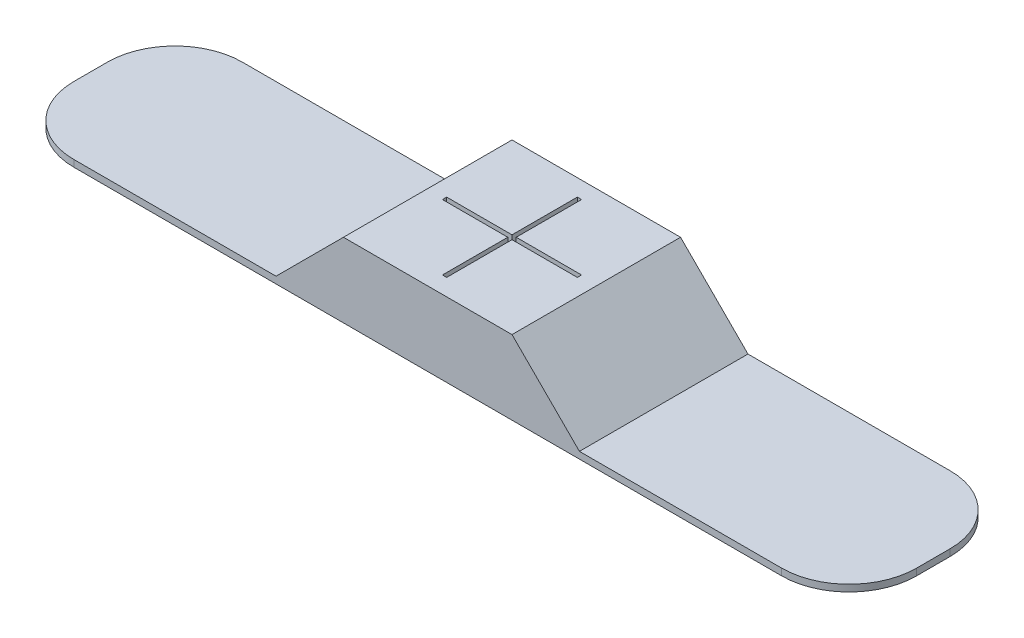
ISO-10303-21;
HEADER;
FILE_DESCRIPTION(('STEP AP214'),'2;1');
FILE_NAME('part.step','',(''),(''),'','','');
FILE_SCHEMA(('AUTOMOTIVE_DESIGN { 1 0 10303 214 1 1 1 1 }'));
ENDSEC;
DATA;
#1=APPLICATION_CONTEXT('core data for automotive mechanical design processes');
#2=APPLICATION_PROTOCOL_DEFINITION('international standard','automotive_design',2000,#1);
#3=PRODUCT_CONTEXT('',#1,'mechanical');
#4=PRODUCT('Part','Part','',(#3));
#5=PRODUCT_RELATED_PRODUCT_CATEGORY('part','',(#4));
#6=PRODUCT_DEFINITION_FORMATION('','',#4);
#7=PRODUCT_DEFINITION_CONTEXT('part definition',#1,'design');
#8=PRODUCT_DEFINITION('design','',#6,#7);
#9=PRODUCT_DEFINITION_SHAPE('','',#8);
#10=(LENGTH_UNIT() NAMED_UNIT(*) SI_UNIT(.MILLI.,.METRE.));
#11=(NAMED_UNIT(*) PLANE_ANGLE_UNIT() SI_UNIT($,.RADIAN.));
#12=(NAMED_UNIT(*) SI_UNIT($,.STERADIAN.) SOLID_ANGLE_UNIT());
#13=UNCERTAINTY_MEASURE_WITH_UNIT(LENGTH_MEASURE(1.E-05),#10,'distance_accuracy_value','');
#14=(GEOMETRIC_REPRESENTATION_CONTEXT(3) GLOBAL_UNCERTAINTY_ASSIGNED_CONTEXT((#13)) GLOBAL_UNIT_ASSIGNED_CONTEXT((#10,
#11,#12)) REPRESENTATION_CONTEXT('',''));
#15=CARTESIAN_POINT('',(0.,0.,0.));
#16=DIRECTION('',(0.,0.,1.));
#17=DIRECTION('',(1.,0.,0.));
#18=AXIS2_PLACEMENT_3D('',#15,#16,#17);
#19=CARTESIAN_POINT('',(0.,25.4,31.75));
#20=DIRECTION('',(0.,0.,-1.));
#21=DIRECTION('',(-1.,0.,0.));
#22=AXIS2_PLACEMENT_3D('',#19,#20,#21);
#23=PLANE('',#22);
#24=DIRECTION('',(-1.,0.,0.));
#25=VECTOR('',#24,1.);
#26=CARTESIAN_POINT('',(0.,0.,31.75));
#27=LINE('',#26,#25);
#28=CARTESIAN_POINT('',(-57.1500000000002,0.,31.75));
#29=VERTEX_POINT('',#28);
#30=CARTESIAN_POINT('',(-133.35,0.,31.75));
#31=VERTEX_POINT('',#30);
#32=EDGE_CURVE('E400',#29,#31,#27,.T.);
#33=ORIENTED_EDGE('',*,*,#32,.T.);
#34=DIRECTION('',(0.,1.,0.));
#35=VECTOR('',#34,1.);
#36=CARTESIAN_POINT('',(-133.35,-2.54,31.75));
#37=LINE('',#36,#35);
#38=CARTESIAN_POINT('',(-133.35,-2.54,31.75));
#39=VERTEX_POINT('',#38);
#40=EDGE_CURVE('E365',#31,#39,#37,.F.);
#41=ORIENTED_EDGE('',*,*,#40,.T.);
#42=DIRECTION('',(1.,0.,0.));
#43=VECTOR('',#42,1.);
#44=CARTESIAN_POINT('',(0.,-2.54,31.75));
#45=LINE('',#44,#43);
#46=CARTESIAN_POINT('',(133.35,-2.54,31.75));
#47=VERTEX_POINT('',#46);
#48=EDGE_CURVE('E281',#39,#47,#45,.T.);
#49=ORIENTED_EDGE('',*,*,#48,.T.);
#50=DIRECTION('',(0.,1.,0.));
#51=VECTOR('',#50,1.);
#52=CARTESIAN_POINT('',(133.35,25.4,31.75));
#53=LINE('',#52,#51);
#54=CARTESIAN_POINT('',(133.35,0.,31.75));
#55=VERTEX_POINT('',#54);
#56=EDGE_CURVE('E362',#47,#55,#53,.T.);
#57=ORIENTED_EDGE('',*,*,#56,.T.);
#58=DIRECTION('',(1.,0.,0.));
#59=VECTOR('',#58,1.);
#60=CARTESIAN_POINT('',(0.,0.,31.75));
#61=LINE('',#60,#59);
#62=CARTESIAN_POINT('',(57.1499999999999,0.,31.75));
#63=VERTEX_POINT('',#62);
#64=EDGE_CURVE('E397',#63,#55,#61,.T.);
#65=ORIENTED_EDGE('',*,*,#64,.F.);
#66=DIRECTION('',(-0.707106781186544,0.707106781186551,0.));
#67=VECTOR('',#66,1.);
#68=CARTESIAN_POINT('',(15.8750000000002,41.2750000000001,31.75));
#69=LINE('',#68,#67);
#70=CARTESIAN_POINT('',(31.75,25.4,31.75));
#71=VERTEX_POINT('',#70);
#72=EDGE_CURVE('E351',#63,#71,#69,.T.);
#73=ORIENTED_EDGE('',*,*,#72,.T.);
#74=DIRECTION('',(1.,0.,0.));
#75=VECTOR('',#74,1.);
#76=CARTESIAN_POINT('',(0.,25.4,31.75));
#77=LINE('',#76,#75);
#78=CARTESIAN_POINT('',(-31.75,25.4,31.75));
#79=VERTEX_POINT('',#78);
#80=EDGE_CURVE('E433',#79,#71,#77,.T.);
#81=ORIENTED_EDGE('',*,*,#80,.F.);
#82=DIRECTION('',(0.707106781186551,0.707106781186544,0.));
#83=VECTOR('',#82,1.);
#84=CARTESIAN_POINT('',(-15.8749999999998,41.275,31.75));
#85=LINE('',#84,#83);
#86=EDGE_CURVE('E347',#79,#29,#85,.F.);
#87=ORIENTED_EDGE('',*,*,#86,.T.);
#88=EDGE_LOOP('',(#33,#41,#49,#57,#65,#73,#81,#87));
#89=FACE_BOUND('',#88,.T.);
#90=ADVANCED_FACE('F93',(#89),#23,.F.);
#91=CARTESIAN_POINT('',(0.,25.4,-31.75));
#92=DIRECTION('',(0.,0.,-1.));
#93=DIRECTION('',(-1.,0.,0.));
#94=AXIS2_PLACEMENT_3D('',#91,#92,#93);
#95=PLANE('',#94);
#96=DIRECTION('',(1.,0.,0.));
#97=VECTOR('',#96,1.);
#98=CARTESIAN_POINT('',(0.,-2.54,-31.75));
#99=LINE('',#98,#97);
#100=CARTESIAN_POINT('',(-133.35,-2.54,-31.75));
#101=VERTEX_POINT('',#100);
#102=CARTESIAN_POINT('',(133.35,-2.54,-31.75));
#103=VERTEX_POINT('',#102);
#104=EDGE_CURVE('E278',#101,#103,#99,.T.);
#105=ORIENTED_EDGE('',*,*,#104,.F.);
#106=DIRECTION('',(0.,1.,0.));
#107=VECTOR('',#106,1.);
#108=CARTESIAN_POINT('',(-133.35,25.4,-31.75));
#109=LINE('',#108,#107);
#110=CARTESIAN_POINT('',(-133.35,0.,-31.75));
#111=VERTEX_POINT('',#110);
#112=EDGE_CURVE('E377',#101,#111,#109,.T.);
#113=ORIENTED_EDGE('',*,*,#112,.T.);
#114=DIRECTION('',(-1.,0.,0.));
#115=VECTOR('',#114,1.);
#116=CARTESIAN_POINT('',(0.,0.,-31.75));
#117=LINE('',#116,#115);
#118=CARTESIAN_POINT('',(-57.1500000000002,0.,-31.75));
#119=VERTEX_POINT('',#118);
#120=EDGE_CURVE('E479',#119,#111,#117,.T.);
#121=ORIENTED_EDGE('',*,*,#120,.F.);
#122=DIRECTION('',(-0.707106781186551,-0.707106781186544,0.));
#123=VECTOR('',#122,1.);
#124=CARTESIAN_POINT('',(-57.1500000000002,0.,-31.75));
#125=LINE('',#124,#123);
#126=CARTESIAN_POINT('',(-31.75,25.4,-31.75));
#127=VERTEX_POINT('',#126);
#128=EDGE_CURVE('E345',#119,#127,#125,.F.);
#129=ORIENTED_EDGE('',*,*,#128,.T.);
#130=DIRECTION('',(1.,0.,0.));
#131=VECTOR('',#130,1.);
#132=CARTESIAN_POINT('',(0.,25.4,-31.75));
#133=LINE('',#132,#131);
#134=CARTESIAN_POINT('',(31.75,25.4,-31.75));
#135=VERTEX_POINT('',#134);
#136=EDGE_CURVE('E438',#127,#135,#133,.T.);
#137=ORIENTED_EDGE('',*,*,#136,.T.);
#138=DIRECTION('',(0.707106781186544,-0.707106781186551,0.));
#139=VECTOR('',#138,1.);
#140=CARTESIAN_POINT('',(31.75,25.4000000000002,-31.75));
#141=LINE('',#140,#139);
#142=CARTESIAN_POINT('',(57.1499999999999,0.,-31.75));
#143=VERTEX_POINT('',#142);
#144=EDGE_CURVE('E349',#135,#143,#141,.T.);
#145=ORIENTED_EDGE('',*,*,#144,.T.);
#146=DIRECTION('',(1.,0.,0.));
#147=VECTOR('',#146,1.);
#148=CARTESIAN_POINT('',(0.,0.,-31.75));
#149=LINE('',#148,#147);
#150=CARTESIAN_POINT('',(133.35,0.,-31.75));
#151=VERTEX_POINT('',#150);
#152=EDGE_CURVE('E394',#143,#151,#149,.T.);
#153=ORIENTED_EDGE('',*,*,#152,.T.);
#154=DIRECTION('',(0.,1.,0.));
#155=VECTOR('',#154,1.);
#156=CARTESIAN_POINT('',(133.35,-2.54,-31.75));
#157=LINE('',#156,#155);
#158=EDGE_CURVE('E375',#151,#103,#157,.F.);
#159=ORIENTED_EDGE('',*,*,#158,.T.);
#160=EDGE_LOOP('',(#105,#113,#121,#129,#137,#145,#153,#159));
#161=FACE_BOUND('',#160,.T.);
#162=ADVANCED_FACE('F456',(#161),#95,.T.);
#163=CARTESIAN_POINT('',(-0.793750000000017,25.4,0.));
#164=DIRECTION('',(1.,0.,0.));
#165=DIRECTION('',(0.,0.,-1.));
#166=AXIS2_PLACEMENT_3D('',#163,#164,#165);
#167=PLANE('',#166);
#168=DIRECTION('',(0.,0.,1.));
#169=VECTOR('',#168,1.);
#170=CARTESIAN_POINT('',(-0.793750000000017,0.,0.));
#171=LINE('',#170,#169);
#172=CARTESIAN_POINT('',(-0.793749999999998,0.,-25.4));
#173=VERTEX_POINT('',#172);
#174=CARTESIAN_POINT('',(-0.793749999999999,0.,-0.793750000000011));
#175=VERTEX_POINT('',#174);
#176=EDGE_CURVE('E256',#173,#175,#171,.T.);
#177=ORIENTED_EDGE('',*,*,#176,.F.);
#178=DIRECTION('',(0.,-1.,0.));
#179=VECTOR('',#178,1.);
#180=CARTESIAN_POINT('',(-0.793749999999998,25.4,-25.4));
#181=LINE('',#180,#179);
#182=CARTESIAN_POINT('',(-0.793749999999998,25.4,-25.4));
#183=VERTEX_POINT('',#182);
#184=EDGE_CURVE('E265',#183,#173,#181,.T.);
#185=ORIENTED_EDGE('',*,*,#184,.F.);
#186=DIRECTION('',(0.,0.,1.));
#187=VECTOR('',#186,1.);
#188=CARTESIAN_POINT('',(-0.793750000000017,25.4,0.));
#189=LINE('',#188,#187);
#190=CARTESIAN_POINT('',(-0.793749999999999,25.4,-0.793750000000011));
#191=VERTEX_POINT('',#190);
#192=EDGE_CURVE('E311',#183,#191,#189,.T.);
#193=ORIENTED_EDGE('',*,*,#192,.T.);
#194=DIRECTION('',(0.,-1.,0.));
#195=VECTOR('',#194,1.);
#196=CARTESIAN_POINT('',(-0.793749999999999,25.4,-0.793750000000011));
#197=LINE('',#196,#195);
#198=EDGE_CURVE('E276',#191,#175,#197,.T.);
#199=ORIENTED_EDGE('',*,*,#198,.T.);
#200=EDGE_LOOP('',(#177,#185,#193,#199));
#201=FACE_BOUND('',#200,.T.);
#202=ADVANCED_FACE('F274',(#201),#167,.T.);
#203=CARTESIAN_POINT('',(0.,25.4,-25.4));
#204=DIRECTION('',(0.,0.,-1.));
#205=DIRECTION('',(-1.,0.,0.));
#206=AXIS2_PLACEMENT_3D('',#203,#204,#205);
#207=PLANE('',#206);
#208=DIRECTION('',(1.,0.,0.));
#209=VECTOR('',#208,1.);
#210=CARTESIAN_POINT('',(0.,0.,-25.4));
#211=LINE('',#210,#209);
#212=CARTESIAN_POINT('',(0.793750000000001,0.,-25.4));
#213=VERTEX_POINT('',#212);
#214=EDGE_CURVE('E252',#173,#213,#211,.T.);
#215=ORIENTED_EDGE('',*,*,#214,.T.);
#216=DIRECTION('',(0.,-1.,0.));
#217=VECTOR('',#216,1.);
#218=CARTESIAN_POINT('',(0.793750000000001,25.4,-25.4));
#219=LINE('',#218,#217);
#220=CARTESIAN_POINT('',(0.793750000000001,25.4,-25.4));
#221=VERTEX_POINT('',#220);
#222=EDGE_CURVE('E272',#221,#213,#219,.T.);
#223=ORIENTED_EDGE('',*,*,#222,.F.);
#224=DIRECTION('',(1.,0.,0.));
#225=VECTOR('',#224,1.);
#226=CARTESIAN_POINT('',(0.,25.4,-25.4));
#227=LINE('',#226,#225);
#228=EDGE_CURVE('E267',#183,#221,#227,.T.);
#229=ORIENTED_EDGE('',*,*,#228,.F.);
#230=ORIENTED_EDGE('',*,*,#184,.T.);
#231=EDGE_LOOP('',(#215,#223,#229,#230));
#232=FACE_BOUND('',#231,.T.);
#233=ADVANCED_FACE('F266',(#232),#207,.F.);
#234=CARTESIAN_POINT('',(0.793749999999989,25.4,0.));
#235=DIRECTION('',(1.,0.,0.));
#236=DIRECTION('',(0.,0.,-1.));
#237=AXIS2_PLACEMENT_3D('',#234,#235,#236);
#238=PLANE('',#237);
#239=DIRECTION('',(0.,0.,1.));
#240=VECTOR('',#239,1.);
#241=CARTESIAN_POINT('',(0.793749999999989,0.,0.));
#242=LINE('',#241,#240);
#243=CARTESIAN_POINT('',(0.793750000000006,0.,-0.793750000000003));
#244=VERTEX_POINT('',#243);
#245=EDGE_CURVE('E259',#213,#244,#242,.T.);
#246=ORIENTED_EDGE('',*,*,#245,.T.);
#247=DIRECTION('',(0.,-1.,0.));
#248=VECTOR('',#247,1.);
#249=CARTESIAN_POINT('',(0.793750000000006,25.4,-0.793750000000003));
#250=LINE('',#249,#248);
#251=CARTESIAN_POINT('',(0.793750000000006,25.4,-0.793750000000003));
#252=VERTEX_POINT('',#251);
#253=EDGE_CURVE('E337',#252,#244,#250,.T.);
#254=ORIENTED_EDGE('',*,*,#253,.F.);
#255=DIRECTION('',(0.,0.,1.));
#256=VECTOR('',#255,1.);
#257=CARTESIAN_POINT('',(0.793749999999989,25.4,0.));
#258=LINE('',#257,#256);
#259=EDGE_CURVE('E410',#221,#252,#258,.T.);
#260=ORIENTED_EDGE('',*,*,#259,.F.);
#261=ORIENTED_EDGE('',*,*,#222,.T.);
#262=EDGE_LOOP('',(#246,#254,#260,#261));
#263=FACE_BOUND('',#262,.T.);
#264=ADVANCED_FACE('F542',(#263),#238,.F.);
#265=CARTESIAN_POINT('',(0.,25.4,-0.793750000000012));
#266=DIRECTION('',(0.,0.,1.));
#267=DIRECTION('',(1.,0.,0.));
#268=AXIS2_PLACEMENT_3D('',#265,#266,#267);
#269=PLANE('',#268);
#270=DIRECTION('',(-1.,0.,0.));
#271=VECTOR('',#270,1.);
#272=CARTESIAN_POINT('',(0.,0.,-0.793750000000012));
#273=LINE('',#272,#271);
#274=CARTESIAN_POINT('',(25.4,0.,-0.793749999999731));
#275=VERTEX_POINT('',#274);
#276=EDGE_CURVE('E288',#275,#244,#273,.T.);
#277=ORIENTED_EDGE('',*,*,#276,.F.);
#278=DIRECTION('',(0.,-1.,0.));
#279=VECTOR('',#278,1.);
#280=CARTESIAN_POINT('',(25.4,25.4,-0.793749999999731));
#281=LINE('',#280,#279);
#282=CARTESIAN_POINT('',(25.4,25.4,-0.793749999999731));
#283=VERTEX_POINT('',#282);
#284=EDGE_CURVE('E334',#283,#275,#281,.T.);
#285=ORIENTED_EDGE('',*,*,#284,.F.);
#286=DIRECTION('',(-1.,0.,0.));
#287=VECTOR('',#286,1.);
#288=CARTESIAN_POINT('',(0.,25.4,-0.793750000000012));
#289=LINE('',#288,#287);
#290=EDGE_CURVE('E412',#283,#252,#289,.T.);
#291=ORIENTED_EDGE('',*,*,#290,.T.);
#292=ORIENTED_EDGE('',*,*,#253,.T.);
#293=EDGE_LOOP('',(#277,#285,#291,#292));
#294=FACE_BOUND('',#293,.T.);
#295=ADVANCED_FACE('F538',(#294),#269,.T.);
#296=CARTESIAN_POINT('',(25.4,25.4,2.22044604925031E-13));
#297=DIRECTION('',(1.,0.,0.));
#298=DIRECTION('',(0.,0.,-1.));
#299=AXIS2_PLACEMENT_3D('',#296,#297,#298);
#300=PLANE('',#299);
#301=DIRECTION('',(0.,0.,1.));
#302=VECTOR('',#301,1.);
#303=CARTESIAN_POINT('',(25.4,0.,2.22044604925031E-13));
#304=LINE('',#303,#302);
#305=CARTESIAN_POINT('',(25.4,0.,0.793750000000268));
#306=VERTEX_POINT('',#305);
#307=EDGE_CURVE('E290',#275,#306,#304,.T.);
#308=ORIENTED_EDGE('',*,*,#307,.T.);
#309=DIRECTION('',(0.,-1.,0.));
#310=VECTOR('',#309,1.);
#311=CARTESIAN_POINT('',(25.4,25.4,0.793750000000268));
#312=LINE('',#311,#310);
#313=CARTESIAN_POINT('',(25.4,25.4,0.793750000000268));
#314=VERTEX_POINT('',#313);
#315=EDGE_CURVE('E331',#314,#306,#312,.T.);
#316=ORIENTED_EDGE('',*,*,#315,.F.);
#317=DIRECTION('',(0.,0.,1.));
#318=VECTOR('',#317,1.);
#319=CARTESIAN_POINT('',(25.4,25.4,2.22044604925031E-13));
#320=LINE('',#319,#318);
#321=EDGE_CURVE('E415',#283,#314,#320,.T.);
#322=ORIENTED_EDGE('',*,*,#321,.F.);
#323=ORIENTED_EDGE('',*,*,#284,.T.);
#324=EDGE_LOOP('',(#308,#316,#322,#323));
#325=FACE_BOUND('',#324,.T.);
#326=ADVANCED_FACE('F534',(#325),#300,.F.);
#327=CARTESIAN_POINT('',(0.,25.4,0.793749999999997));
#328=DIRECTION('',(0.,0.,1.));
#329=DIRECTION('',(1.,0.,0.));
#330=AXIS2_PLACEMENT_3D('',#327,#328,#329);
#331=PLANE('',#330);
#332=DIRECTION('',(-1.,0.,0.));
#333=VECTOR('',#332,1.);
#334=CARTESIAN_POINT('',(0.,0.,0.793749999999997));
#335=LINE('',#334,#333);
#336=CARTESIAN_POINT('',(0.793750000000005,0.,0.793750000000006));
#337=VERTEX_POINT('',#336);
#338=EDGE_CURVE('E293',#306,#337,#335,.T.);
#339=ORIENTED_EDGE('',*,*,#338,.T.);
#340=DIRECTION('',(0.,-1.,0.));
#341=VECTOR('',#340,1.);
#342=CARTESIAN_POINT('',(0.793750000000005,25.4,0.793750000000006));
#343=LINE('',#342,#341);
#344=CARTESIAN_POINT('',(0.793750000000005,25.4,0.793750000000006));
#345=VERTEX_POINT('',#344);
#346=EDGE_CURVE('E328',#345,#337,#343,.T.);
#347=ORIENTED_EDGE('',*,*,#346,.F.);
#348=DIRECTION('',(-1.,0.,0.));
#349=VECTOR('',#348,1.);
#350=CARTESIAN_POINT('',(0.,25.4,0.793749999999997));
#351=LINE('',#350,#349);
#352=EDGE_CURVE('E417',#314,#345,#351,.T.);
#353=ORIENTED_EDGE('',*,*,#352,.F.);
#354=ORIENTED_EDGE('',*,*,#315,.T.);
#355=EDGE_LOOP('',(#339,#347,#353,#354));
#356=FACE_BOUND('',#355,.T.);
#357=ADVANCED_FACE('F530',(#356),#331,.F.);
#358=CARTESIAN_POINT('',(0.793750000000016,25.4,0.));
#359=DIRECTION('',(-1.,0.,0.));
#360=DIRECTION('',(0.,0.,1.));
#361=AXIS2_PLACEMENT_3D('',#358,#359,#360);
#362=PLANE('',#361);
#363=DIRECTION('',(0.,0.,-1.));
#364=VECTOR('',#363,1.);
#365=CARTESIAN_POINT('',(0.793750000000016,0.,0.));
#366=LINE('',#365,#364);
#367=CARTESIAN_POINT('',(0.793749999999642,0.,25.4));
#368=VERTEX_POINT('',#367);
#369=EDGE_CURVE('E296',#368,#337,#366,.T.);
#370=ORIENTED_EDGE('',*,*,#369,.F.);
#371=DIRECTION('',(0.,-1.,0.));
#372=VECTOR('',#371,1.);
#373=CARTESIAN_POINT('',(0.793749999999642,25.4,25.4));
#374=LINE('',#373,#372);
#375=CARTESIAN_POINT('',(0.793749999999642,25.4,25.4));
#376=VERTEX_POINT('',#375);
#377=EDGE_CURVE('E325',#376,#368,#374,.T.);
#378=ORIENTED_EDGE('',*,*,#377,.F.);
#379=DIRECTION('',(0.,0.,-1.));
#380=VECTOR('',#379,1.);
#381=CARTESIAN_POINT('',(0.793750000000016,25.4,0.));
#382=LINE('',#381,#380);
#383=EDGE_CURVE('E419',#376,#345,#382,.T.);
#384=ORIENTED_EDGE('',*,*,#383,.T.);
#385=ORIENTED_EDGE('',*,*,#346,.T.);
#386=EDGE_LOOP('',(#370,#378,#384,#385));
#387=FACE_BOUND('',#386,.T.);
#388=ADVANCED_FACE('F526',(#387),#362,.T.);
#389=CARTESIAN_POINT('',(-3.33066907387547E-13,25.4,25.4));
#390=DIRECTION('',(0.,0.,1.));
#391=DIRECTION('',(1.,0.,0.));
#392=AXIS2_PLACEMENT_3D('',#389,#390,#391);
#393=PLANE('',#392);
#394=DIRECTION('',(-1.,0.,0.));
#395=VECTOR('',#394,1.);
#396=CARTESIAN_POINT('',(-3.33066907387547E-13,0.,25.4));
#397=LINE('',#396,#395);
#398=CARTESIAN_POINT('',(-0.793750000000357,0.,25.4));
#399=VERTEX_POINT('',#398);
#400=EDGE_CURVE('E298',#368,#399,#397,.T.);
#401=ORIENTED_EDGE('',*,*,#400,.T.);
#402=DIRECTION('',(0.,-1.,0.));
#403=VECTOR('',#402,1.);
#404=CARTESIAN_POINT('',(-0.793750000000357,25.4,25.4));
#405=LINE('',#404,#403);
#406=CARTESIAN_POINT('',(-0.793750000000357,25.4,25.4));
#407=VERTEX_POINT('',#406);
#408=EDGE_CURVE('E322',#407,#399,#405,.T.);
#409=ORIENTED_EDGE('',*,*,#408,.F.);
#410=DIRECTION('',(-1.,0.,0.));
#411=VECTOR('',#410,1.);
#412=CARTESIAN_POINT('',(-3.33066907387547E-13,25.4,25.4));
#413=LINE('',#412,#411);
#414=EDGE_CURVE('E422',#376,#407,#413,.T.);
#415=ORIENTED_EDGE('',*,*,#414,.F.);
#416=ORIENTED_EDGE('',*,*,#377,.T.);
#417=EDGE_LOOP('',(#401,#409,#415,#416));
#418=FACE_BOUND('',#417,.T.);
#419=ADVANCED_FACE('F522',(#418),#393,.F.);
#420=CARTESIAN_POINT('',(-0.793749999999997,25.4,0.));
#421=DIRECTION('',(-1.,0.,0.));
#422=DIRECTION('',(0.,0.,1.));
#423=AXIS2_PLACEMENT_3D('',#420,#421,#422);
#424=PLANE('',#423);
#425=DIRECTION('',(0.,0.,-1.));
#426=VECTOR('',#425,1.);
#427=CARTESIAN_POINT('',(-0.793749999999997,0.,0.));
#428=LINE('',#427,#426);
#429=CARTESIAN_POINT('',(-0.793750000000008,0.,0.793750000000002));
#430=VERTEX_POINT('',#429);
#431=EDGE_CURVE('E301',#399,#430,#428,.T.);
#432=ORIENTED_EDGE('',*,*,#431,.T.);
#433=DIRECTION('',(0.,-1.,0.));
#434=VECTOR('',#433,1.);
#435=CARTESIAN_POINT('',(-0.793750000000008,25.4,0.793750000000002));
#436=LINE('',#435,#434);
#437=CARTESIAN_POINT('',(-0.793750000000008,25.4,0.793750000000002));
#438=VERTEX_POINT('',#437);
#439=EDGE_CURVE('E319',#438,#430,#436,.T.);
#440=ORIENTED_EDGE('',*,*,#439,.F.);
#441=DIRECTION('',(0.,0.,-1.));
#442=VECTOR('',#441,1.);
#443=CARTESIAN_POINT('',(-0.793749999999997,25.4,0.));
#444=LINE('',#443,#442);
#445=EDGE_CURVE('E424',#407,#438,#444,.T.);
#446=ORIENTED_EDGE('',*,*,#445,.F.);
#447=ORIENTED_EDGE('',*,*,#408,.T.);
#448=EDGE_LOOP('',(#432,#440,#446,#447));
#449=FACE_BOUND('',#448,.T.);
#450=ADVANCED_FACE('F518',(#449),#424,.F.);
#451=CARTESIAN_POINT('',(0.,25.4,0.793750000000016));
#452=DIRECTION('',(0.,0.,-1.));
#453=DIRECTION('',(-1.,0.,0.));
#454=AXIS2_PLACEMENT_3D('',#451,#452,#453);
#455=PLANE('',#454);
#456=DIRECTION('',(1.,0.,0.));
#457=VECTOR('',#456,1.);
#458=CARTESIAN_POINT('',(0.,0.,0.793750000000016));
#459=LINE('',#458,#457);
#460=CARTESIAN_POINT('',(-25.4,0.,0.793749999999553));
#461=VERTEX_POINT('',#460);
#462=EDGE_CURVE('E304',#461,#430,#459,.T.);
#463=ORIENTED_EDGE('',*,*,#462,.F.);
#464=DIRECTION('',(0.,-1.,0.));
#465=VECTOR('',#464,1.);
#466=CARTESIAN_POINT('',(-25.4,25.4,0.793749999999553));
#467=LINE('',#466,#465);
#468=CARTESIAN_POINT('',(-25.4,25.4,0.793749999999553));
#469=VERTEX_POINT('',#468);
#470=EDGE_CURVE('E316',#469,#461,#467,.T.);
#471=ORIENTED_EDGE('',*,*,#470,.F.);
#472=DIRECTION('',(1.,0.,0.));
#473=VECTOR('',#472,1.);
#474=CARTESIAN_POINT('',(0.,25.4,0.793750000000016));
#475=LINE('',#474,#473);
#476=EDGE_CURVE('E426',#469,#438,#475,.T.);
#477=ORIENTED_EDGE('',*,*,#476,.T.);
#478=ORIENTED_EDGE('',*,*,#439,.T.);
#479=EDGE_LOOP('',(#463,#471,#477,#478));
#480=FACE_BOUND('',#479,.T.);
#481=ADVANCED_FACE('F514',(#480),#455,.T.);
#482=CARTESIAN_POINT('',(-25.4,25.4,-4.44089209850063E-13));
#483=DIRECTION('',(-1.,0.,0.));
#484=DIRECTION('',(0.,0.,1.));
#485=AXIS2_PLACEMENT_3D('',#482,#483,#484);
#486=PLANE('',#485);
#487=DIRECTION('',(0.,0.,-1.));
#488=VECTOR('',#487,1.);
#489=CARTESIAN_POINT('',(-25.4,0.,-4.44089209850063E-13));
#490=LINE('',#489,#488);
#491=CARTESIAN_POINT('',(-25.4,0.,-0.793750000000446));
#492=VERTEX_POINT('',#491);
#493=EDGE_CURVE('E306',#461,#492,#490,.T.);
#494=ORIENTED_EDGE('',*,*,#493,.T.);
#495=DIRECTION('',(0.,-1.,0.));
#496=VECTOR('',#495,1.);
#497=CARTESIAN_POINT('',(-25.4,25.4,-0.793750000000446));
#498=LINE('',#497,#496);
#499=CARTESIAN_POINT('',(-25.4,25.4,-0.793750000000446));
#500=VERTEX_POINT('',#499);
#501=EDGE_CURVE('E313',#500,#492,#498,.T.);
#502=ORIENTED_EDGE('',*,*,#501,.F.);
#503=DIRECTION('',(0.,0.,-1.));
#504=VECTOR('',#503,1.);
#505=CARTESIAN_POINT('',(-25.4,25.4,-4.44089209850063E-13));
#506=LINE('',#505,#504);
#507=EDGE_CURVE('E429',#469,#500,#506,.T.);
#508=ORIENTED_EDGE('',*,*,#507,.F.);
#509=ORIENTED_EDGE('',*,*,#470,.T.);
#510=EDGE_LOOP('',(#494,#502,#508,#509));
#511=FACE_BOUND('',#510,.T.);
#512=ADVANCED_FACE('F510',(#511),#486,.F.);
#513=CARTESIAN_POINT('',(0.,25.4,-0.793749999999997));
#514=DIRECTION('',(0.,0.,-1.));
#515=DIRECTION('',(-1.,0.,0.));
#516=AXIS2_PLACEMENT_3D('',#513,#514,#515);
#517=PLANE('',#516);
#518=DIRECTION('',(1.,0.,0.));
#519=VECTOR('',#518,1.);
#520=CARTESIAN_POINT('',(0.,0.,-0.793749999999997));
#521=LINE('',#520,#519);
#522=EDGE_CURVE('E309',#492,#175,#521,.T.);
#523=ORIENTED_EDGE('',*,*,#522,.T.);
#524=ORIENTED_EDGE('',*,*,#198,.F.);
#525=DIRECTION('',(1.,0.,0.));
#526=VECTOR('',#525,1.);
#527=CARTESIAN_POINT('',(0.,25.4,-0.793749999999997));
#528=LINE('',#527,#526);
#529=EDGE_CURVE('E431',#500,#191,#528,.T.);
#530=ORIENTED_EDGE('',*,*,#529,.F.);
#531=ORIENTED_EDGE('',*,*,#501,.T.);
#532=EDGE_LOOP('',(#523,#524,#530,#531));
#533=FACE_BOUND('',#532,.T.);
#534=ADVANCED_FACE('F507',(#533),#517,.F.);
#535=CARTESIAN_POINT('',(0.,25.4,0.));
#536=DIRECTION('',(0.,1.,0.));
#537=DIRECTION('',(0.,0.,1.));
#538=AXIS2_PLACEMENT_3D('',#535,#536,#537);
#539=PLANE('',#538);
#540=ORIENTED_EDGE('',*,*,#192,.F.);
#541=ORIENTED_EDGE('',*,*,#228,.T.);
#542=ORIENTED_EDGE('',*,*,#259,.T.);
#543=ORIENTED_EDGE('',*,*,#290,.F.);
#544=ORIENTED_EDGE('',*,*,#321,.T.);
#545=ORIENTED_EDGE('',*,*,#352,.T.);
#546=ORIENTED_EDGE('',*,*,#383,.F.);
#547=ORIENTED_EDGE('',*,*,#414,.T.);
#548=ORIENTED_EDGE('',*,*,#445,.T.);
#549=ORIENTED_EDGE('',*,*,#476,.F.);
#550=ORIENTED_EDGE('',*,*,#507,.T.);
#551=ORIENTED_EDGE('',*,*,#529,.T.);
#552=EDGE_LOOP('',(#540,#541,#542,#543,#544,#545,#546,#547,#548,#549,#550,#551));
#553=FACE_BOUND('',#552,.T.);
#554=ORIENTED_EDGE('',*,*,#80,.T.);
#555=DIRECTION('',(0.,0.,-1.));
#556=VECTOR('',#555,1.);
#557=CARTESIAN_POINT('',(31.75,25.4,0.));
#558=LINE('',#557,#556);
#559=EDGE_CURVE('E436',#71,#135,#558,.T.);
#560=ORIENTED_EDGE('',*,*,#559,.T.);
#561=ORIENTED_EDGE('',*,*,#136,.F.);
#562=DIRECTION('',(0.,0.,-1.));
#563=VECTOR('',#562,1.);
#564=CARTESIAN_POINT('',(-31.75,25.4,0.));
#565=LINE('',#564,#563);
#566=EDGE_CURVE('E284',#79,#127,#565,.T.);
#567=ORIENTED_EDGE('',*,*,#566,.F.);
#568=EDGE_LOOP('',(#554,#560,#561,#567));
#569=FACE_BOUND('',#568,.T.);
#570=ADVANCED_FACE('F449',(#553,#569),#539,.T.);
#571=CARTESIAN_POINT('',(0.,0.,0.));
#572=DIRECTION('',(0.,1.,0.));
#573=DIRECTION('',(0.,0.,1.));
#574=AXIS2_PLACEMENT_3D('',#571,#572,#573);
#575=PLANE('',#574);
#576=ORIENTED_EDGE('',*,*,#214,.F.);
#577=ORIENTED_EDGE('',*,*,#176,.T.);
#578=ORIENTED_EDGE('',*,*,#522,.F.);
#579=ORIENTED_EDGE('',*,*,#493,.F.);
#580=ORIENTED_EDGE('',*,*,#462,.T.);
#581=ORIENTED_EDGE('',*,*,#431,.F.);
#582=ORIENTED_EDGE('',*,*,#400,.F.);
#583=ORIENTED_EDGE('',*,*,#369,.T.);
#584=ORIENTED_EDGE('',*,*,#338,.F.);
#585=ORIENTED_EDGE('',*,*,#307,.F.);
#586=ORIENTED_EDGE('',*,*,#276,.T.);
#587=ORIENTED_EDGE('',*,*,#245,.F.);
#588=EDGE_LOOP('',(#576,#577,#578,#579,#580,#581,#582,#583,#584,#585,#586,#587));
#589=FACE_BOUND('',#588,.T.);
#590=ADVANCED_FACE('F254',(#589),#575,.T.);
#591=CARTESIAN_POINT('',(0.,-2.54,0.));
#592=DIRECTION('',(0.,1.,0.));
#593=DIRECTION('',(0.,0.,1.));
#594=AXIS2_PLACEMENT_3D('',#591,#592,#593);
#595=PLANE('',#594);
#596=ORIENTED_EDGE('',*,*,#48,.F.);
#597=CARTESIAN_POINT('',(-133.35,-2.54,6.35));
#598=DIRECTION('',(0.,1.,0.));
#599=DIRECTION('',(0.,0.,1.));
#600=AXIS2_PLACEMENT_3D('',#597,#598,#599);
#601=CIRCLE('',#600,25.4);
#602=CARTESIAN_POINT('',(-158.75,-2.54,6.35));
#603=VERTEX_POINT('',#602);
#604=EDGE_CURVE('E373',#39,#603,#601,.F.);
#605=ORIENTED_EDGE('',*,*,#604,.T.);
#606=DIRECTION('',(0.,0.,1.));
#607=VECTOR('',#606,1.);
#608=CARTESIAN_POINT('',(-158.75,-2.54,0.));
#609=LINE('',#608,#607);
#610=CARTESIAN_POINT('',(-158.75,-2.54,-6.35));
#611=VERTEX_POINT('',#610);
#612=EDGE_CURVE('E395',#611,#603,#609,.T.);
#613=ORIENTED_EDGE('',*,*,#612,.F.);
#614=CARTESIAN_POINT('',(-133.35,-2.54,-6.35));
#615=DIRECTION('',(0.,1.,0.));
#616=DIRECTION('',(0.,0.,1.));
#617=AXIS2_PLACEMENT_3D('',#614,#615,#616);
#618=CIRCLE('',#617,25.4);
#619=EDGE_CURVE('E371',#611,#101,#618,.F.);
#620=ORIENTED_EDGE('',*,*,#619,.T.);
#621=ORIENTED_EDGE('',*,*,#104,.T.);
#622=CARTESIAN_POINT('',(133.35,-2.54,-6.35));
#623=DIRECTION('',(0.,1.,0.));
#624=DIRECTION('',(0.,0.,1.));
#625=AXIS2_PLACEMENT_3D('',#622,#623,#624);
#626=CIRCLE('',#625,25.4);
#627=CARTESIAN_POINT('',(158.75,-2.54,-6.35));
#628=VERTEX_POINT('',#627);
#629=EDGE_CURVE('E369',#103,#628,#626,.F.);
#630=ORIENTED_EDGE('',*,*,#629,.T.);
#631=DIRECTION('',(0.,0.,1.));
#632=VECTOR('',#631,1.);
#633=CARTESIAN_POINT('',(158.75,-2.54,0.));
#634=LINE('',#633,#632);
#635=CARTESIAN_POINT('',(158.75,-2.54,6.35));
#636=VERTEX_POINT('',#635);
#637=EDGE_CURVE('E389',#628,#636,#634,.T.);
#638=ORIENTED_EDGE('',*,*,#637,.T.);
#639=CARTESIAN_POINT('',(133.35,-2.54,6.35));
#640=DIRECTION('',(0.,1.,0.));
#641=DIRECTION('',(0.,0.,1.));
#642=AXIS2_PLACEMENT_3D('',#639,#640,#641);
#643=CIRCLE('',#642,25.4);
#644=EDGE_CURVE('E367',#636,#47,#643,.F.);
#645=ORIENTED_EDGE('',*,*,#644,.T.);
#646=EDGE_LOOP('',(#596,#605,#613,#620,#621,#630,#638,#645));
#647=FACE_BOUND('',#646,.T.);
#648=ADVANCED_FACE('F465',(#647),#595,.F.);
#649=CARTESIAN_POINT('',(158.75,-2.54,0.));
#650=DIRECTION('',(-1.,0.,0.));
#651=DIRECTION('',(0.,0.,1.));
#652=AXIS2_PLACEMENT_3D('',#649,#650,#651);
#653=PLANE('',#652);
#654=ORIENTED_EDGE('',*,*,#637,.F.);
#655=DIRECTION('',(0.,1.,0.));
#656=VECTOR('',#655,1.);
#657=CARTESIAN_POINT('',(158.75,0.,-6.35));
#658=LINE('',#657,#656);
#659=CARTESIAN_POINT('',(158.75,0.,-6.35));
#660=VERTEX_POINT('',#659);
#661=EDGE_CURVE('E382',#628,#660,#658,.T.);
#662=ORIENTED_EDGE('',*,*,#661,.T.);
#663=DIRECTION('',(0.,0.,1.));
#664=VECTOR('',#663,1.);
#665=CARTESIAN_POINT('',(158.75,0.,0.));
#666=LINE('',#665,#664);
#667=CARTESIAN_POINT('',(158.75,0.,6.35));
#668=VERTEX_POINT('',#667);
#669=EDGE_CURVE('E386',#660,#668,#666,.T.);
#670=ORIENTED_EDGE('',*,*,#669,.T.);
#671=DIRECTION('',(0.,1.,0.));
#672=VECTOR('',#671,1.);
#673=CARTESIAN_POINT('',(158.75,-2.54,6.35));
#674=LINE('',#673,#672);
#675=EDGE_CURVE('E380',#668,#636,#674,.F.);
#676=ORIENTED_EDGE('',*,*,#675,.T.);
#677=EDGE_LOOP('',(#654,#662,#670,#676));
#678=FACE_BOUND('',#677,.T.);
#679=ADVANCED_FACE('F385',(#678),#653,.F.);
#680=CARTESIAN_POINT('',(0.,0.,0.));
#681=DIRECTION('',(0.,1.,0.));
#682=DIRECTION('',(0.,0.,1.));
#683=AXIS2_PLACEMENT_3D('',#680,#681,#682);
#684=PLANE('',#683);
#685=ORIENTED_EDGE('',*,*,#669,.F.);
#686=CARTESIAN_POINT('',(133.35,0.,-6.35));
#687=DIRECTION('',(0.,1.,0.));
#688=DIRECTION('',(0.,0.,1.));
#689=AXIS2_PLACEMENT_3D('',#686,#687,#688);
#690=CIRCLE('',#689,25.4);
#691=EDGE_CURVE('E12',#660,#151,#690,.T.);
#692=ORIENTED_EDGE('',*,*,#691,.T.);
#693=ORIENTED_EDGE('',*,*,#152,.F.);
#694=DIRECTION('',(0.,0.,1.));
#695=VECTOR('',#694,1.);
#696=CARTESIAN_POINT('',(57.1499999999999,0.,0.));
#697=LINE('',#696,#695);
#698=EDGE_CURVE('E343',#143,#63,#697,.T.);
#699=ORIENTED_EDGE('',*,*,#698,.T.);
#700=ORIENTED_EDGE('',*,*,#64,.T.);
#701=CARTESIAN_POINT('',(133.35,0.,6.35));
#702=DIRECTION('',(0.,1.,0.));
#703=DIRECTION('',(0.,0.,1.));
#704=AXIS2_PLACEMENT_3D('',#701,#702,#703);
#705=CIRCLE('',#704,25.4);
#706=EDGE_CURVE('E101',#55,#668,#705,.T.);
#707=ORIENTED_EDGE('',*,*,#706,.T.);
#708=EDGE_LOOP('',(#685,#692,#693,#699,#700,#707));
#709=FACE_BOUND('',#708,.T.);
#710=ADVANCED_FACE('F391',(#709),#684,.T.);
#711=CARTESIAN_POINT('',(-158.75,-2.54,0.));
#712=DIRECTION('',(-1.,0.,0.));
#713=DIRECTION('',(0.,0.,1.));
#714=AXIS2_PLACEMENT_3D('',#711,#712,#713);
#715=PLANE('',#714);
#716=ORIENTED_EDGE('',*,*,#612,.T.);
#717=DIRECTION('',(0.,1.,0.));
#718=VECTOR('',#717,1.);
#719=CARTESIAN_POINT('',(-158.75,0.,6.35));
#720=LINE('',#719,#718);
#721=CARTESIAN_POINT('',(-158.75,0.,6.35));
#722=VERTEX_POINT('',#721);
#723=EDGE_CURVE('E355',#603,#722,#720,.T.);
#724=ORIENTED_EDGE('',*,*,#723,.T.);
#725=DIRECTION('',(0.,0.,1.));
#726=VECTOR('',#725,1.);
#727=CARTESIAN_POINT('',(-158.75,0.,0.));
#728=LINE('',#727,#726);
#729=CARTESIAN_POINT('',(-158.75,0.,-6.35));
#730=VERTEX_POINT('',#729);
#731=EDGE_CURVE('E478',#730,#722,#728,.T.);
#732=ORIENTED_EDGE('',*,*,#731,.F.);
#733=DIRECTION('',(0.,1.,0.));
#734=VECTOR('',#733,1.);
#735=CARTESIAN_POINT('',(-158.75,-2.54,-6.35));
#736=LINE('',#735,#734);
#737=EDGE_CURVE('E353',#730,#611,#736,.F.);
#738=ORIENTED_EDGE('',*,*,#737,.T.);
#739=EDGE_LOOP('',(#716,#724,#732,#738));
#740=FACE_BOUND('',#739,.T.);
#741=ADVANCED_FACE('F481',(#740),#715,.T.);
#742=CARTESIAN_POINT('',(0.,0.,0.));
#743=DIRECTION('',(0.,1.,0.));
#744=DIRECTION('',(0.,0.,1.));
#745=AXIS2_PLACEMENT_3D('',#742,#743,#744);
#746=PLANE('',#745);
#747=ORIENTED_EDGE('',*,*,#731,.T.);
#748=CARTESIAN_POINT('',(-133.35,0.,6.35));
#749=DIRECTION('',(0.,1.,0.));
#750=DIRECTION('',(0.,0.,1.));
#751=AXIS2_PLACEMENT_3D('',#748,#749,#750);
#752=CIRCLE('',#751,25.4);
#753=EDGE_CURVE('E360',#722,#31,#752,.T.);
#754=ORIENTED_EDGE('',*,*,#753,.T.);
#755=ORIENTED_EDGE('',*,*,#32,.F.);
#756=DIRECTION('',(0.,0.,-1.));
#757=VECTOR('',#756,1.);
#758=CARTESIAN_POINT('',(-57.1500000000002,0.,-31.75));
#759=LINE('',#758,#757);
#760=EDGE_CURVE('E271',#29,#119,#759,.T.);
#761=ORIENTED_EDGE('',*,*,#760,.T.);
#762=ORIENTED_EDGE('',*,*,#120,.T.);
#763=CARTESIAN_POINT('',(-133.35,0.,-6.35));
#764=DIRECTION('',(0.,1.,0.));
#765=DIRECTION('',(0.,0.,1.));
#766=AXIS2_PLACEMENT_3D('',#763,#764,#765);
#767=CIRCLE('',#766,25.4);
#768=EDGE_CURVE('E358',#111,#730,#767,.T.);
#769=ORIENTED_EDGE('',*,*,#768,.T.);
#770=EDGE_LOOP('',(#747,#754,#755,#761,#762,#769));
#771=FACE_BOUND('',#770,.T.);
#772=ADVANCED_FACE('F477',(#771),#746,.T.);
#773=CARTESIAN_POINT('',(-57.1500000000002,0.,0.));
#774=DIRECTION('',(-0.707106781186544,0.707106781186551,0.));
#775=DIRECTION('',(0.,0.,1.));
#776=AXIS2_PLACEMENT_3D('',#773,#774,#775);
#777=PLANE('',#776);
#778=ORIENTED_EDGE('',*,*,#86,.F.);
#779=ORIENTED_EDGE('',*,*,#566,.T.);
#780=ORIENTED_EDGE('',*,*,#128,.F.);
#781=ORIENTED_EDGE('',*,*,#760,.F.);
#782=EDGE_LOOP('',(#778,#779,#780,#781));
#783=FACE_BOUND('',#782,.T.);
#784=ADVANCED_FACE('F446',(#783),#777,.T.);
#785=CARTESIAN_POINT('',(31.75,25.4000000000002,0.));
#786=DIRECTION('',(-0.707106781186551,-0.707106781186544,0.));
#787=DIRECTION('',(0.,0.,-1.));
#788=AXIS2_PLACEMENT_3D('',#785,#786,#787);
#789=PLANE('',#788);
#790=ORIENTED_EDGE('',*,*,#72,.F.);
#791=ORIENTED_EDGE('',*,*,#698,.F.);
#792=ORIENTED_EDGE('',*,*,#144,.F.);
#793=ORIENTED_EDGE('',*,*,#559,.F.);
#794=EDGE_LOOP('',(#790,#791,#792,#793));
#795=FACE_BOUND('',#794,.T.);
#796=ADVANCED_FACE('F453',(#795),#789,.F.);
#797=CARTESIAN_POINT('',(-133.35,-2.54,6.35));
#798=DIRECTION('',(0.,-1.,0.));
#799=DIRECTION('',(0.,0.,-1.));
#800=AXIS2_PLACEMENT_3D('',#797,#798,#799);
#801=CYLINDRICAL_SURFACE('',#800,25.4);
#802=ORIENTED_EDGE('',*,*,#604,.F.);
#803=ORIENTED_EDGE('',*,*,#40,.F.);
#804=ORIENTED_EDGE('',*,*,#753,.F.);
#805=ORIENTED_EDGE('',*,*,#723,.F.);
#806=EDGE_LOOP('',(#802,#803,#804,#805));
#807=FACE_BOUND('',#806,.T.);
#808=ADVANCED_FACE('F490',(#807),#801,.T.);
#809=CARTESIAN_POINT('',(-133.35,25.4,-6.35));
#810=DIRECTION('',(0.,1.,0.));
#811=DIRECTION('',(0.,0.,1.));
#812=AXIS2_PLACEMENT_3D('',#809,#810,#811);
#813=CYLINDRICAL_SURFACE('',#812,25.4);
#814=ORIENTED_EDGE('',*,*,#619,.F.);
#815=ORIENTED_EDGE('',*,*,#737,.F.);
#816=ORIENTED_EDGE('',*,*,#768,.F.);
#817=ORIENTED_EDGE('',*,*,#112,.F.);
#818=EDGE_LOOP('',(#814,#815,#816,#817));
#819=FACE_BOUND('',#818,.T.);
#820=ADVANCED_FACE('F472',(#819),#813,.T.);
#821=CARTESIAN_POINT('',(133.35,-2.54,-6.35));
#822=DIRECTION('',(0.,-1.,0.));
#823=DIRECTION('',(0.,0.,-1.));
#824=AXIS2_PLACEMENT_3D('',#821,#822,#823);
#825=CYLINDRICAL_SURFACE('',#824,25.4);
#826=ORIENTED_EDGE('',*,*,#629,.F.);
#827=ORIENTED_EDGE('',*,*,#158,.F.);
#828=ORIENTED_EDGE('',*,*,#691,.F.);
#829=ORIENTED_EDGE('',*,*,#661,.F.);
#830=EDGE_LOOP('',(#826,#827,#828,#829));
#831=FACE_BOUND('',#830,.T.);
#832=ADVANCED_FACE('F466',(#831),#825,.T.);
#833=CARTESIAN_POINT('',(133.35,25.4,6.35));
#834=DIRECTION('',(0.,1.,0.));
#835=DIRECTION('',(0.,0.,1.));
#836=AXIS2_PLACEMENT_3D('',#833,#834,#835);
#837=CYLINDRICAL_SURFACE('',#836,25.4);
#838=ORIENTED_EDGE('',*,*,#644,.F.);
#839=ORIENTED_EDGE('',*,*,#675,.F.);
#840=ORIENTED_EDGE('',*,*,#706,.F.);
#841=ORIENTED_EDGE('',*,*,#56,.F.);
#842=EDGE_LOOP('',(#838,#839,#840,#841));
#843=FACE_BOUND('',#842,.T.);
#844=ADVANCED_FACE('F95',(#843),#837,.T.);
#845=CLOSED_SHELL('',(#90,#162,#202,#233,#264,#295,#326,#357,#388,#419,#450,#481,#512,#534,#570,
#590,#648,#679,#710,#741,#772,#784,#796,#808,#820,#832,#844));
#846=MANIFOLD_SOLID_BREP('B2',#845);
#847=ADVANCED_BREP_SHAPE_REPRESENTATION('',(#18,#846),#14);
#848=SHAPE_DEFINITION_REPRESENTATION(#9,#847);
ENDSEC;
END-ISO-10303-21;
